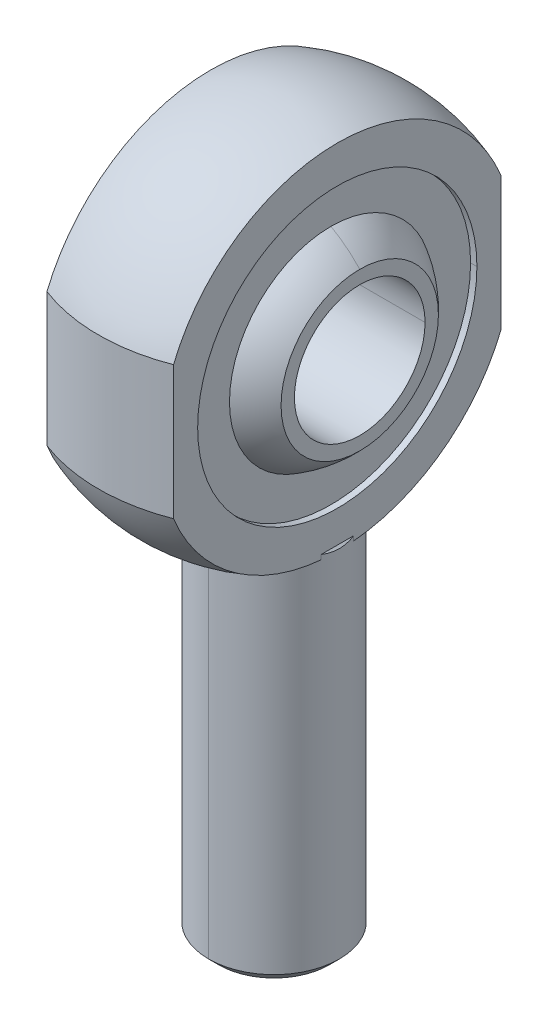
ISO-10303-21;
HEADER;
FILE_DESCRIPTION(('STEP AP214'),'2;1');
FILE_NAME('part.step','',(''),(''),'','','');
FILE_SCHEMA(('AUTOMOTIVE_DESIGN { 1 0 10303 214 1 1 1 1 }'));
ENDSEC;
DATA;
#1=APPLICATION_CONTEXT('core data for automotive mechanical design processes');
#2=APPLICATION_PROTOCOL_DEFINITION('international standard','automotive_design',2000,#1);
#3=PRODUCT_CONTEXT('',#1,'mechanical');
#4=PRODUCT('Part','Part','',(#3));
#5=PRODUCT_RELATED_PRODUCT_CATEGORY('part','',(#4));
#6=PRODUCT_DEFINITION_FORMATION('','',#4);
#7=PRODUCT_DEFINITION_CONTEXT('part definition',#1,'design');
#8=PRODUCT_DEFINITION('design','',#6,#7);
#9=PRODUCT_DEFINITION_SHAPE('','',#8);
#10=(LENGTH_UNIT() NAMED_UNIT(*) SI_UNIT(.MILLI.,.METRE.));
#11=(NAMED_UNIT(*) PLANE_ANGLE_UNIT() SI_UNIT($,.RADIAN.));
#12=(NAMED_UNIT(*) SI_UNIT($,.STERADIAN.) SOLID_ANGLE_UNIT());
#13=UNCERTAINTY_MEASURE_WITH_UNIT(LENGTH_MEASURE(1.E-05),#10,'distance_accuracy_value','');
#14=(GEOMETRIC_REPRESENTATION_CONTEXT(3) GLOBAL_UNCERTAINTY_ASSIGNED_CONTEXT((#13)) GLOBAL_UNIT_ASSIGNED_CONTEXT((#10,
#11,#12)) REPRESENTATION_CONTEXT('',''));
#15=CARTESIAN_POINT('',(0.,0.,0.));
#16=DIRECTION('',(0.,0.,1.));
#17=DIRECTION('',(1.,0.,0.));
#18=AXIS2_PLACEMENT_3D('',#15,#16,#17);
#19=CARTESIAN_POINT('',(10.5,-55.525,0.));
#20=DIRECTION('',(0.,-1.,0.));
#21=DIRECTION('',(1.,0.,0.));
#22=AXIS2_PLACEMENT_3D('',#19,#20,#21);
#23=CYLINDRICAL_SURFACE('',#22,8.);
#24=DIRECTION('',(0.,-1.,0.));
#25=VECTOR('',#24,1.);
#26=CARTESIAN_POINT('',(10.5,-21.5638586528556,8.));
#27=LINE('',#26,#25);
#28=CARTESIAN_POINT('',(10.5,-21.5638586528556,8.));
#29=VERTEX_POINT('',#28);
#30=CARTESIAN_POINT('',(10.5,-64.773,8.));
#31=VERTEX_POINT('',#30);
#32=EDGE_CURVE('E11',#29,#31,#27,.T.);
#33=ORIENTED_EDGE('',*,*,#32,.F.);
#34=CARTESIAN_POINT('',(10.5,-21.5638586528556,0.));
#35=DIRECTION('',(0.,1.,0.));
#36=DIRECTION('',(0.,0.,1.));
#37=AXIS2_PLACEMENT_3D('',#34,#35,#36);
#38=CIRCLE('',#37,8.);
#39=CARTESIAN_POINT('',(2.75,-21.5638586528481,1.98431348329844));
#40=VERTEX_POINT('',#39);
#41=EDGE_CURVE('E24',#40,#29,#38,.T.);
#42=ORIENTED_EDGE('',*,*,#41,.F.);
#43=DIRECTION('',(0.,-1.,0.));
#44=VECTOR('',#43,1.);
#45=CARTESIAN_POINT('',(2.75,-55.525,1.98431348329844));
#46=LINE('',#45,#44);
#47=CARTESIAN_POINT('',(2.75,-21.,1.98431348329844));
#48=VERTEX_POINT('',#47);
#49=EDGE_CURVE('E454',#48,#40,#46,.T.);
#50=ORIENTED_EDGE('',*,*,#49,.F.);
#51=CARTESIAN_POINT('',(10.5,-13.25,0.));
#52=DIRECTION('',(-0.707106781186548,0.707106781186548,0.));
#53=DIRECTION('',(-0.707106781186548,-0.707106781186548,0.));
#54=AXIS2_PLACEMENT_3D('',#51,#52,#53);
#55=ELLIPSE('',#54,11.3137084989848,8.);
#56=CARTESIAN_POINT('',(2.75,-21.,-1.98431348329844));
#57=VERTEX_POINT('',#56);
#58=EDGE_CURVE('E449',#57,#48,#55,.T.);
#59=ORIENTED_EDGE('',*,*,#58,.F.);
#60=DIRECTION('',(0.,1.,0.));
#61=VECTOR('',#60,1.);
#62=CARTESIAN_POINT('',(2.75,-55.525,-1.98431348329844));
#63=LINE('',#62,#61);
#64=CARTESIAN_POINT('',(2.75,-21.5638586528481,-1.98431348329844));
#65=VERTEX_POINT('',#64);
#66=EDGE_CURVE('E444',#65,#57,#63,.T.);
#67=ORIENTED_EDGE('',*,*,#66,.F.);
#68=CARTESIAN_POINT('',(10.5,-21.5638586528556,0.));
#69=DIRECTION('',(0.,1.,0.));
#70=DIRECTION('',(0.,0.,1.));
#71=AXIS2_PLACEMENT_3D('',#68,#69,#70);
#72=CIRCLE('',#71,8.);
#73=CARTESIAN_POINT('',(10.5,-21.5638586528556,-8.));
#74=VERTEX_POINT('',#73);
#75=EDGE_CURVE('E439',#74,#65,#72,.T.);
#76=ORIENTED_EDGE('',*,*,#75,.F.);
#77=DIRECTION('',(0.,-1.,0.));
#78=VECTOR('',#77,1.);
#79=CARTESIAN_POINT('',(10.5,-21.5638586528556,-8.));
#80=LINE('',#79,#78);
#81=CARTESIAN_POINT('',(10.5,-64.773,-8.));
#82=VERTEX_POINT('',#81);
#83=EDGE_CURVE('E435',#74,#82,#80,.T.);
#84=ORIENTED_EDGE('',*,*,#83,.T.);
#85=CARTESIAN_POINT('',(10.5,-64.773,0.));
#86=DIRECTION('',(0.,-1.,0.));
#87=DIRECTION('',(0.,0.,-1.));
#88=AXIS2_PLACEMENT_3D('',#85,#86,#87);
#89=CIRCLE('',#88,8.);
#90=EDGE_CURVE('E430',#31,#82,#89,.T.);
#91=ORIENTED_EDGE('',*,*,#90,.F.);
#92=EDGE_LOOP('',(#33,#42,#50,#59,#67,#76,#84,#91));
#93=FACE_BOUND('',#92,.T.);
#94=ADVANCED_FACE('F16',(#93),#23,.T.);
#95=CARTESIAN_POINT('',(10.5,-64.773,0.));
#96=DIRECTION('',(0.,1.,0.));
#97=DIRECTION('',(1.,0.,0.));
#98=AXIS2_PLACEMENT_3D('',#95,#96,#97);
#99=CONICAL_SURFACE('',#98,8.,0.785398163397446);
#100=DIRECTION('',(0.,0.70710678118655,-0.707106781186546));
#101=VECTOR('',#100,1.);
#102=CARTESIAN_POINT('',(10.5,-66.,-6.773));
#103=LINE('',#102,#101);
#104=CARTESIAN_POINT('',(10.5,-66.,-6.773));
#105=VERTEX_POINT('',#104);
#106=EDGE_CURVE('E425',#105,#82,#103,.T.);
#107=ORIENTED_EDGE('',*,*,#106,.F.);
#108=CARTESIAN_POINT('',(10.5,-66.,0.));
#109=DIRECTION('',(0.,-1.,0.));
#110=DIRECTION('',(0.,0.,-1.));
#111=AXIS2_PLACEMENT_3D('',#108,#109,#110);
#112=CIRCLE('',#111,6.773);
#113=CARTESIAN_POINT('',(10.5,-66.,6.773));
#114=VERTEX_POINT('',#113);
#115=EDGE_CURVE('E420',#114,#105,#112,.T.);
#116=ORIENTED_EDGE('',*,*,#115,.F.);
#117=DIRECTION('',(0.,0.70710678118655,0.707106781186546));
#118=VECTOR('',#117,1.);
#119=CARTESIAN_POINT('',(10.5,-66.,6.773));
#120=LINE('',#119,#118);
#121=EDGE_CURVE('E415',#114,#31,#120,.T.);
#122=ORIENTED_EDGE('',*,*,#121,.T.);
#123=ORIENTED_EDGE('',*,*,#90,.T.);
#124=EDGE_LOOP('',(#107,#116,#122,#123));
#125=FACE_BOUND('',#124,.T.);
#126=ADVANCED_FACE('F485',(#125),#99,.T.);
#127=CARTESIAN_POINT('',(10.5,-64.773,0.));
#128=DIRECTION('',(0.,1.,0.));
#129=DIRECTION('',(-1.,0.,0.));
#130=AXIS2_PLACEMENT_3D('',#127,#128,#129);
#131=CONICAL_SURFACE('',#130,8.,0.785398163397446);
#132=ORIENTED_EDGE('',*,*,#106,.T.);
#133=CARTESIAN_POINT('',(10.5,-64.773,0.));
#134=DIRECTION('',(0.,-1.,0.));
#135=DIRECTION('',(0.,0.,-1.));
#136=AXIS2_PLACEMENT_3D('',#133,#134,#135);
#137=CIRCLE('',#136,8.);
#138=EDGE_CURVE('E410',#82,#31,#137,.T.);
#139=ORIENTED_EDGE('',*,*,#138,.T.);
#140=ORIENTED_EDGE('',*,*,#121,.F.);
#141=CARTESIAN_POINT('',(10.5,-66.,0.));
#142=DIRECTION('',(0.,-1.,0.));
#143=DIRECTION('',(0.,0.,-1.));
#144=AXIS2_PLACEMENT_3D('',#141,#142,#143);
#145=CIRCLE('',#144,6.773);
#146=EDGE_CURVE('E405',#105,#114,#145,.T.);
#147=ORIENTED_EDGE('',*,*,#146,.F.);
#148=EDGE_LOOP('',(#132,#139,#140,#147));
#149=FACE_BOUND('',#148,.T.);
#150=ADVANCED_FACE('F483',(#149),#131,.T.);
#151=CARTESIAN_POINT('',(17.273,-66.,0.));
#152=DIRECTION('',(0.,1.,0.));
#153=DIRECTION('',(0.,0.,1.));
#154=AXIS2_PLACEMENT_3D('',#151,#152,#153);
#155=PLANE('',#154);
#156=ORIENTED_EDGE('',*,*,#146,.T.);
#157=ORIENTED_EDGE('',*,*,#115,.T.);
#158=EDGE_LOOP('',(#156,#157));
#159=FACE_BOUND('',#158,.T.);
#160=ADVANCED_FACE('F487',(#159),#155,.F.);
#161=CARTESIAN_POINT('',(10.5,-55.525,0.));
#162=DIRECTION('',(0.,-1.,0.));
#163=DIRECTION('',(-1.,0.,0.));
#164=AXIS2_PLACEMENT_3D('',#161,#162,#163);
#165=CYLINDRICAL_SURFACE('',#164,8.);
#166=ORIENTED_EDGE('',*,*,#32,.T.);
#167=ORIENTED_EDGE('',*,*,#138,.F.);
#168=ORIENTED_EDGE('',*,*,#83,.F.);
#169=CARTESIAN_POINT('',(10.5,-21.5638586528556,0.));
#170=DIRECTION('',(0.,1.,0.));
#171=DIRECTION('',(0.,0.,1.));
#172=AXIS2_PLACEMENT_3D('',#169,#170,#171);
#173=CIRCLE('',#172,8.);
#174=CARTESIAN_POINT('',(18.25,-21.5638586528556,-1.98431348325763));
#175=VERTEX_POINT('',#174);
#176=EDGE_CURVE('E400',#175,#74,#173,.T.);
#177=ORIENTED_EDGE('',*,*,#176,.F.);
#178=DIRECTION('',(0.,-1.,0.));
#179=VECTOR('',#178,1.);
#180=CARTESIAN_POINT('',(18.25,-55.525,-1.98431348329844));
#181=LINE('',#180,#179);
#182=CARTESIAN_POINT('',(18.25,-21.,-1.98431348329844));
#183=VERTEX_POINT('',#182);
#184=EDGE_CURVE('E395',#183,#175,#181,.T.);
#185=ORIENTED_EDGE('',*,*,#184,.F.);
#186=CARTESIAN_POINT('',(10.5,-13.25,0.));
#187=DIRECTION('',(0.707106781186548,0.707106781186548,0.));
#188=DIRECTION('',(0.707106781186548,-0.707106781186548,0.));
#189=AXIS2_PLACEMENT_3D('',#186,#187,#188);
#190=ELLIPSE('',#189,11.3137084989848,8.);
#191=CARTESIAN_POINT('',(18.25,-21.,1.98431348329844));
#192=VERTEX_POINT('',#191);
#193=EDGE_CURVE('E390',#192,#183,#190,.T.);
#194=ORIENTED_EDGE('',*,*,#193,.F.);
#195=DIRECTION('',(0.,1.,0.));
#196=VECTOR('',#195,1.);
#197=CARTESIAN_POINT('',(18.25,-55.525,1.98431348329844));
#198=LINE('',#197,#196);
#199=CARTESIAN_POINT('',(18.25,-21.5638586528556,1.98431348325763));
#200=VERTEX_POINT('',#199);
#201=EDGE_CURVE('E385',#200,#192,#198,.T.);
#202=ORIENTED_EDGE('',*,*,#201,.F.);
#203=CARTESIAN_POINT('',(10.5,-21.5638586528556,0.));
#204=DIRECTION('',(0.,1.,0.));
#205=DIRECTION('',(0.,0.,1.));
#206=AXIS2_PLACEMENT_3D('',#203,#204,#205);
#207=CIRCLE('',#206,8.);
#208=EDGE_CURVE('E380',#29,#200,#207,.T.);
#209=ORIENTED_EDGE('',*,*,#208,.F.);
#210=EDGE_LOOP('',(#166,#167,#168,#177,#185,#194,#202,#209));
#211=FACE_BOUND('',#210,.T.);
#212=ADVANCED_FACE('F479',(#211),#165,.T.);
#213=CARTESIAN_POINT('',(10.5,-3.7470027081099E-12,0.));
#214=DIRECTION('',(1.,0.,0.));
#215=DIRECTION('',(0.,0.796262108454219,-0.604951778772525));
#216=AXIS2_PLACEMENT_3D('',#213,#214,#215);
#217=SPHERICAL_SURFACE('',#216,23.0000000000038);
#218=CARTESIAN_POINT('',(2.75,0.,0.));
#219=DIRECTION('',(1.,0.,0.));
#220=DIRECTION('',(0.,0.,-1.));
#221=AXIS2_PLACEMENT_3D('',#218,#219,#220);
#222=CIRCLE('',#221,21.654964788704);
#223=CARTESIAN_POINT('',(2.75,-8.17006731918472,20.0546129356814));
#224=VERTEX_POINT('',#223);
#225=EDGE_CURVE('E376',#224,#40,#222,.T.);
#226=ORIENTED_EDGE('',*,*,#225,.T.);
#227=ORIENTED_EDGE('',*,*,#41,.T.);
#228=ORIENTED_EDGE('',*,*,#208,.T.);
#229=CARTESIAN_POINT('',(18.25,0.,0.));
#230=DIRECTION('',(1.,0.,0.));
#231=DIRECTION('',(0.,0.,-1.));
#232=AXIS2_PLACEMENT_3D('',#229,#230,#231);
#233=CIRCLE('',#232,21.654964788704);
#234=CARTESIAN_POINT('',(18.25,-8.17006731919838,20.0546129356786));
#235=VERTEX_POINT('',#234);
#236=EDGE_CURVE('E371',#235,#200,#233,.T.);
#237=ORIENTED_EDGE('',*,*,#236,.F.);
#238=CARTESIAN_POINT('',(10.5,-8.17006731919838,0.));
#239=DIRECTION('',(0.,1.,0.));
#240=DIRECTION('',(0.,0.,1.));
#241=AXIS2_PLACEMENT_3D('',#238,#239,#240);
#242=CIRCLE('',#241,21.5);
#243=EDGE_CURVE('E366',#224,#235,#242,.T.);
#244=ORIENTED_EDGE('',*,*,#243,.F.);
#245=EDGE_LOOP('',(#226,#227,#228,#237,#244));
#246=FACE_BOUND('',#245,.T.);
#247=ADVANCED_FACE('F464',(#246),#217,.T.);
#248=CARTESIAN_POINT('',(10.5,43.,0.));
#249=DIRECTION('',(0.,-1.,0.));
#250=DIRECTION('',(0.,0.,-1.));
#251=AXIS2_PLACEMENT_3D('',#248,#249,#250);
#252=CYLINDRICAL_SURFACE('',#251,21.5);
#253=DIRECTION('',(0.,1.,0.));
#254=VECTOR('',#253,1.);
#255=CARTESIAN_POINT('',(18.25,43.,20.0546129356814));
#256=LINE('',#255,#254);
#257=CARTESIAN_POINT('',(18.25,8.17006731919089,20.0546129356802));
#258=VERTEX_POINT('',#257);
#259=EDGE_CURVE('E362',#235,#258,#256,.T.);
#260=ORIENTED_EDGE('',*,*,#259,.T.);
#261=CARTESIAN_POINT('',(10.5,8.17006731919089,0.));
#262=DIRECTION('',(0.,-1.,0.));
#263=DIRECTION('',(0.,0.,-1.));
#264=AXIS2_PLACEMENT_3D('',#261,#262,#263);
#265=CIRCLE('',#264,21.5);
#266=CARTESIAN_POINT('',(2.75,8.17006731918472,20.0546129356814));
#267=VERTEX_POINT('',#266);
#268=EDGE_CURVE('E358',#258,#267,#265,.T.);
#269=ORIENTED_EDGE('',*,*,#268,.T.);
#270=DIRECTION('',(0.,-1.,0.));
#271=VECTOR('',#270,1.);
#272=CARTESIAN_POINT('',(2.75,43.,20.0546129356814));
#273=LINE('',#272,#271);
#274=EDGE_CURVE('E353',#267,#224,#273,.T.);
#275=ORIENTED_EDGE('',*,*,#274,.T.);
#276=ORIENTED_EDGE('',*,*,#243,.T.);
#277=EDGE_LOOP('',(#260,#269,#275,#276));
#278=FACE_BOUND('',#277,.T.);
#279=ADVANCED_FACE('F531',(#278),#252,.T.);
#280=CARTESIAN_POINT('',(2.75,21.654964788704,0.));
#281=DIRECTION('',(-1.,0.,0.));
#282=DIRECTION('',(0.,0.,1.));
#283=AXIS2_PLACEMENT_3D('',#280,#281,#282);
#284=PLANE('',#283);
#285=CARTESIAN_POINT('',(2.75,0.,0.));
#286=DIRECTION('',(1.,0.,0.));
#287=DIRECTION('',(0.,0.,-1.));
#288=AXIS2_PLACEMENT_3D('',#285,#286,#287);
#289=CIRCLE('',#288,17.1);
#290=CARTESIAN_POINT('',(2.75,0.,-17.1));
#291=VERTEX_POINT('',#290);
#292=CARTESIAN_POINT('',(2.75,0.,17.1));
#293=VERTEX_POINT('',#292);
#294=EDGE_CURVE('E168',#291,#293,#289,.T.);
#295=ORIENTED_EDGE('',*,*,#294,.T.);
#296=CARTESIAN_POINT('',(2.75,0.,0.));
#297=DIRECTION('',(1.,0.,0.));
#298=DIRECTION('',(0.,0.,-1.));
#299=AXIS2_PLACEMENT_3D('',#296,#297,#298);
#300=CIRCLE('',#299,17.1);
#301=EDGE_CURVE('E346',#293,#291,#300,.T.);
#302=ORIENTED_EDGE('',*,*,#301,.T.);
#303=EDGE_LOOP('',(#295,#302));
#304=FACE_BOUND('',#303,.T.);
#305=ORIENTED_EDGE('',*,*,#66,.T.);
#306=DIRECTION('',(0.,0.,-1.));
#307=VECTOR('',#306,1.);
#308=CARTESIAN_POINT('',(2.75,-21.,43.));
#309=LINE('',#308,#307);
#310=EDGE_CURVE('E341',#48,#57,#309,.T.);
#311=ORIENTED_EDGE('',*,*,#310,.F.);
#312=ORIENTED_EDGE('',*,*,#49,.T.);
#313=ORIENTED_EDGE('',*,*,#225,.F.);
#314=ORIENTED_EDGE('',*,*,#274,.F.);
#315=CARTESIAN_POINT('',(2.75,0.,0.));
#316=DIRECTION('',(1.,0.,0.));
#317=DIRECTION('',(0.,0.,-1.));
#318=AXIS2_PLACEMENT_3D('',#315,#316,#317);
#319=CIRCLE('',#318,21.654964788704);
#320=CARTESIAN_POINT('',(2.75,8.17006731918472,-20.0546129356814));
#321=VERTEX_POINT('',#320);
#322=EDGE_CURVE('E336',#321,#267,#319,.T.);
#323=ORIENTED_EDGE('',*,*,#322,.F.);
#324=DIRECTION('',(0.,1.,0.));
#325=VECTOR('',#324,1.);
#326=CARTESIAN_POINT('',(2.75,43.,-20.0546129356814));
#327=LINE('',#326,#325);
#328=CARTESIAN_POINT('',(2.75,-8.17006731918472,-20.0546129356814));
#329=VERTEX_POINT('',#328);
#330=EDGE_CURVE('E331',#329,#321,#327,.T.);
#331=ORIENTED_EDGE('',*,*,#330,.F.);
#332=CARTESIAN_POINT('',(2.75,0.,0.));
#333=DIRECTION('',(1.,0.,0.));
#334=DIRECTION('',(0.,0.,-1.));
#335=AXIS2_PLACEMENT_3D('',#332,#333,#334);
#336=CIRCLE('',#335,21.654964788704);
#337=EDGE_CURVE('E326',#65,#329,#336,.T.);
#338=ORIENTED_EDGE('',*,*,#337,.F.);
#339=EDGE_LOOP('',(#305,#311,#312,#313,#314,#323,#331,#338));
#340=FACE_BOUND('',#339,.T.);
#341=ADVANCED_FACE('F469',(#304,#340),#284,.T.);
#342=CARTESIAN_POINT('',(10.5,-3.7470027081099E-12,0.));
#343=DIRECTION('',(1.,0.,0.));
#344=DIRECTION('',(0.,0.79626210845422,0.604951778772524));
#345=AXIS2_PLACEMENT_3D('',#342,#343,#344);
#346=SPHERICAL_SURFACE('',#345,23.0000000000038);
#347=CARTESIAN_POINT('',(18.25,0.,0.));
#348=DIRECTION('',(1.,0.,0.));
#349=DIRECTION('',(0.,0.,-1.));
#350=AXIS2_PLACEMENT_3D('',#347,#348,#349);
#351=CIRCLE('',#350,21.654964788704);
#352=CARTESIAN_POINT('',(18.25,-8.17006731919838,-20.0546129356786));
#353=VERTEX_POINT('',#352);
#354=EDGE_CURVE('E321',#175,#353,#351,.T.);
#355=ORIENTED_EDGE('',*,*,#354,.F.);
#356=ORIENTED_EDGE('',*,*,#176,.T.);
#357=ORIENTED_EDGE('',*,*,#75,.T.);
#358=ORIENTED_EDGE('',*,*,#337,.T.);
#359=CARTESIAN_POINT('',(10.5,-8.17006731919838,0.));
#360=DIRECTION('',(0.,1.,0.));
#361=DIRECTION('',(0.,0.,1.));
#362=AXIS2_PLACEMENT_3D('',#359,#360,#361);
#363=CIRCLE('',#362,21.5);
#364=EDGE_CURVE('E316',#353,#329,#363,.T.);
#365=ORIENTED_EDGE('',*,*,#364,.F.);
#366=EDGE_LOOP('',(#355,#356,#357,#358,#365));
#367=FACE_BOUND('',#366,.T.);
#368=ADVANCED_FACE('F475',(#367),#346,.T.);
#369=CARTESIAN_POINT('',(10.5,43.,0.));
#370=DIRECTION('',(0.,-1.,0.));
#371=DIRECTION('',(0.,0.,1.));
#372=AXIS2_PLACEMENT_3D('',#369,#370,#371);
#373=CYLINDRICAL_SURFACE('',#372,21.5);
#374=DIRECTION('',(0.,-1.,0.));
#375=VECTOR('',#374,1.);
#376=CARTESIAN_POINT('',(18.25,43.,-20.0546129356814));
#377=LINE('',#376,#375);
#378=CARTESIAN_POINT('',(18.25,8.17006731919089,-20.0546129356802));
#379=VERTEX_POINT('',#378);
#380=EDGE_CURVE('E311',#379,#353,#377,.T.);
#381=ORIENTED_EDGE('',*,*,#380,.T.);
#382=ORIENTED_EDGE('',*,*,#364,.T.);
#383=ORIENTED_EDGE('',*,*,#330,.T.);
#384=CARTESIAN_POINT('',(10.5,8.17006731919089,0.));
#385=DIRECTION('',(0.,-1.,0.));
#386=DIRECTION('',(0.,0.,-1.));
#387=AXIS2_PLACEMENT_3D('',#384,#385,#386);
#388=CIRCLE('',#387,21.5);
#389=EDGE_CURVE('E307',#321,#379,#388,.T.);
#390=ORIENTED_EDGE('',*,*,#389,.T.);
#391=EDGE_LOOP('',(#381,#382,#383,#390));
#392=FACE_BOUND('',#391,.T.);
#393=ADVANCED_FACE('F558',(#392),#373,.T.);
#394=CARTESIAN_POINT('',(10.5,-3.7470027081099E-12,0.));
#395=DIRECTION('',(1.,0.,0.));
#396=DIRECTION('',(0.,-1.,0.));
#397=AXIS2_PLACEMENT_3D('',#394,#395,#396);
#398=SPHERICAL_SURFACE('',#397,23.0000000000038);
#399=ORIENTED_EDGE('',*,*,#389,.F.);
#400=ORIENTED_EDGE('',*,*,#322,.T.);
#401=ORIENTED_EDGE('',*,*,#268,.F.);
#402=CARTESIAN_POINT('',(18.25,0.,0.));
#403=DIRECTION('',(1.,0.,0.));
#404=DIRECTION('',(0.,0.,-1.));
#405=AXIS2_PLACEMENT_3D('',#402,#403,#404);
#406=CIRCLE('',#405,21.654964788704);
#407=EDGE_CURVE('E302',#379,#258,#406,.T.);
#408=ORIENTED_EDGE('',*,*,#407,.F.);
#409=EDGE_LOOP('',(#399,#400,#401,#408));
#410=FACE_BOUND('',#409,.T.);
#411=ADVANCED_FACE('F567',(#410),#398,.T.);
#412=CARTESIAN_POINT('',(18.25,17.1,0.));
#413=DIRECTION('',(1.,0.,0.));
#414=DIRECTION('',(0.,0.,-1.));
#415=AXIS2_PLACEMENT_3D('',#412,#413,#414);
#416=PLANE('',#415);
#417=ORIENTED_EDGE('',*,*,#380,.F.);
#418=ORIENTED_EDGE('',*,*,#407,.T.);
#419=ORIENTED_EDGE('',*,*,#259,.F.);
#420=ORIENTED_EDGE('',*,*,#236,.T.);
#421=ORIENTED_EDGE('',*,*,#201,.T.);
#422=DIRECTION('',(0.,0.,-1.));
#423=VECTOR('',#422,1.);
#424=CARTESIAN_POINT('',(18.25,-21.,43.));
#425=LINE('',#424,#423);
#426=EDGE_CURVE('E297',#192,#183,#425,.T.);
#427=ORIENTED_EDGE('',*,*,#426,.T.);
#428=ORIENTED_EDGE('',*,*,#184,.T.);
#429=ORIENTED_EDGE('',*,*,#354,.T.);
#430=EDGE_LOOP('',(#417,#418,#419,#420,#421,#427,#428,#429));
#431=FACE_BOUND('',#430,.T.);
#432=CARTESIAN_POINT('',(18.25,0.,0.));
#433=DIRECTION('',(1.,0.,0.));
#434=DIRECTION('',(0.,0.,-1.));
#435=AXIS2_PLACEMENT_3D('',#432,#433,#434);
#436=CIRCLE('',#435,17.1);
#437=CARTESIAN_POINT('',(18.25,0.,17.1));
#438=VERTEX_POINT('',#437);
#439=CARTESIAN_POINT('',(18.25,0.,-17.1));
#440=VERTEX_POINT('',#439);
#441=EDGE_CURVE('E292',#438,#440,#436,.T.);
#442=ORIENTED_EDGE('',*,*,#441,.F.);
#443=CARTESIAN_POINT('',(18.25,0.,0.));
#444=DIRECTION('',(1.,0.,0.));
#445=DIRECTION('',(0.,0.,-1.));
#446=AXIS2_PLACEMENT_3D('',#443,#444,#445);
#447=CIRCLE('',#446,17.1);
#448=EDGE_CURVE('E287',#440,#438,#447,.T.);
#449=ORIENTED_EDGE('',*,*,#448,.F.);
#450=EDGE_LOOP('',(#442,#449));
#451=FACE_BOUND('',#450,.T.);
#452=ADVANCED_FACE('F577',(#431,#451),#416,.T.);
#453=CARTESIAN_POINT('',(100.,0.,0.));
#454=DIRECTION('',(1.,0.,0.));
#455=DIRECTION('',(0.,-1.,0.));
#456=AXIS2_PLACEMENT_3D('',#453,#454,#455);
#457=CYLINDRICAL_SURFACE('',#456,17.1);
#458=DIRECTION('',(1.,0.,0.));
#459=VECTOR('',#458,1.);
#460=CARTESIAN_POINT('',(17.475,0.,17.1));
#461=LINE('',#460,#459);
#462=CARTESIAN_POINT('',(17.475,0.,17.1));
#463=VERTEX_POINT('',#462);
#464=EDGE_CURVE('E282',#463,#438,#461,.T.);
#465=ORIENTED_EDGE('',*,*,#464,.F.);
#466=CARTESIAN_POINT('',(17.475,0.,0.));
#467=DIRECTION('',(1.,0.,0.));
#468=DIRECTION('',(0.,0.,-1.));
#469=AXIS2_PLACEMENT_3D('',#466,#467,#468);
#470=CIRCLE('',#469,17.1);
#471=CARTESIAN_POINT('',(17.475,0.,-17.1));
#472=VERTEX_POINT('',#471);
#473=EDGE_CURVE('E277',#472,#463,#470,.T.);
#474=ORIENTED_EDGE('',*,*,#473,.F.);
#475=DIRECTION('',(1.,0.,0.));
#476=VECTOR('',#475,1.);
#477=CARTESIAN_POINT('',(17.475,0.,-17.1));
#478=LINE('',#477,#476);
#479=EDGE_CURVE('E272',#472,#440,#478,.T.);
#480=ORIENTED_EDGE('',*,*,#479,.T.);
#481=ORIENTED_EDGE('',*,*,#448,.T.);
#482=EDGE_LOOP('',(#465,#474,#480,#481));
#483=FACE_BOUND('',#482,.T.);
#484=ADVANCED_FACE('F587',(#483),#457,.F.);
#485=CARTESIAN_POINT('',(100.,0.,0.));
#486=DIRECTION('',(1.,0.,0.));
#487=DIRECTION('',(0.,1.,0.));
#488=AXIS2_PLACEMENT_3D('',#485,#486,#487);
#489=CYLINDRICAL_SURFACE('',#488,17.1);
#490=ORIENTED_EDGE('',*,*,#464,.T.);
#491=ORIENTED_EDGE('',*,*,#441,.T.);
#492=ORIENTED_EDGE('',*,*,#479,.F.);
#493=CARTESIAN_POINT('',(17.475,0.,0.));
#494=DIRECTION('',(1.,0.,0.));
#495=DIRECTION('',(0.,0.,-1.));
#496=AXIS2_PLACEMENT_3D('',#493,#494,#495);
#497=CIRCLE('',#496,17.1);
#498=EDGE_CURVE('E267',#463,#472,#497,.T.);
#499=ORIENTED_EDGE('',*,*,#498,.F.);
#500=EDGE_LOOP('',(#490,#491,#492,#499));
#501=FACE_BOUND('',#500,.T.);
#502=ADVANCED_FACE('F597',(#501),#489,.F.);
#503=CARTESIAN_POINT('',(17.475,12.426257481639,0.));
#504=DIRECTION('',(1.,0.,0.));
#505=DIRECTION('',(0.,0.,-1.));
#506=AXIS2_PLACEMENT_3D('',#503,#504,#505);
#507=PLANE('',#506);
#508=ORIENTED_EDGE('',*,*,#473,.T.);
#509=ORIENTED_EDGE('',*,*,#498,.T.);
#510=EDGE_LOOP('',(#508,#509));
#511=FACE_BOUND('',#510,.T.);
#512=CARTESIAN_POINT('',(17.475,0.,0.));
#513=DIRECTION('',(1.,0.,0.));
#514=DIRECTION('',(0.,-1.,0.));
#515=AXIS2_PLACEMENT_3D('',#512,#513,#514);
#516=CIRCLE('',#515,12.426257481639);
#517=CARTESIAN_POINT('',(17.4749999999967,-12.4262574816252,0.));
#518=VERTEX_POINT('',#517);
#519=CARTESIAN_POINT('',(17.4749999999967,12.4262574816409,0.));
#520=VERTEX_POINT('',#519);
#521=EDGE_CURVE('E262',#518,#520,#516,.T.);
#522=ORIENTED_EDGE('',*,*,#521,.F.);
#523=CARTESIAN_POINT('',(17.475,0.,0.));
#524=DIRECTION('',(1.,0.,0.));
#525=DIRECTION('',(0.,0.,-1.));
#526=AXIS2_PLACEMENT_3D('',#523,#524,#525);
#527=CIRCLE('',#526,12.426257481639);
#528=EDGE_CURVE('E257',#520,#518,#527,.T.);
#529=ORIENTED_EDGE('',*,*,#528,.F.);
#530=EDGE_LOOP('',(#522,#529));
#531=FACE_BOUND('',#530,.T.);
#532=ADVANCED_FACE('F607',(#511,#531),#507,.T.);
#533=CARTESIAN_POINT('',(10.5000000000076,7.82880704708333E-12,0.));
#534=DIRECTION('',(1.,0.,0.));
#535=DIRECTION('',(0.,0.,-1.));
#536=AXIS2_PLACEMENT_3D('',#533,#534,#535);
#537=SPHERICAL_SURFACE('',#536,14.2499999999891);
#538=CARTESIAN_POINT('',(10.5000000000076,7.82880704708333E-12,0.));
#539=DIRECTION('',(0.,0.,-1.));
#540=DIRECTION('',(0.736842105262916,-0.676064872561587,0.));
#541=AXIS2_PLACEMENT_3D('',#538,#539,#540);
#542=CIRCLE('',#541,14.2499999999891);
#543=CARTESIAN_POINT('',(20.9999999999961,-9.6339244339874,0.));
#544=VERTEX_POINT('',#543);
#545=EDGE_CURVE('E252',#544,#518,#542,.T.);
#546=ORIENTED_EDGE('',*,*,#545,.F.);
#547=CARTESIAN_POINT('',(21.,0.,0.));
#548=DIRECTION('',(1.,0.,0.));
#549=DIRECTION('',(0.,0.,-1.));
#550=AXIS2_PLACEMENT_3D('',#547,#548,#549);
#551=CIRCLE('',#550,9.6339244339988);
#552=CARTESIAN_POINT('',(20.9999999999961,9.63392443400305,0.));
#553=VERTEX_POINT('',#552);
#554=EDGE_CURVE('E247',#553,#544,#551,.T.);
#555=ORIENTED_EDGE('',*,*,#554,.F.);
#556=CARTESIAN_POINT('',(10.5000000000076,7.82880704708333E-12,0.));
#557=DIRECTION('',(0.,0.,1.));
#558=DIRECTION('',(0.736842105262916,0.676064872561587,0.));
#559=AXIS2_PLACEMENT_3D('',#556,#557,#558);
#560=CIRCLE('',#559,14.2499999999891);
#561=EDGE_CURVE('E242',#553,#520,#560,.T.);
#562=ORIENTED_EDGE('',*,*,#561,.T.);
#563=ORIENTED_EDGE('',*,*,#528,.T.);
#564=EDGE_LOOP('',(#546,#555,#562,#563));
#565=FACE_BOUND('',#564,.T.);
#566=ADVANCED_FACE('F617',(#565),#537,.T.);
#567=CARTESIAN_POINT('',(10.5000000000076,7.82880704708333E-12,0.));
#568=DIRECTION('',(1.,0.,0.));
#569=DIRECTION('',(0.,0.,1.));
#570=AXIS2_PLACEMENT_3D('',#567,#568,#569);
#571=SPHERICAL_SURFACE('',#570,14.2499999999891);
#572=ORIENTED_EDGE('',*,*,#545,.T.);
#573=ORIENTED_EDGE('',*,*,#521,.T.);
#574=ORIENTED_EDGE('',*,*,#561,.F.);
#575=CARTESIAN_POINT('',(21.,0.,0.));
#576=DIRECTION('',(1.,0.,0.));
#577=DIRECTION('',(0.,-1.,0.));
#578=AXIS2_PLACEMENT_3D('',#575,#576,#577);
#579=CIRCLE('',#578,9.6339244339988);
#580=EDGE_CURVE('E237',#544,#553,#579,.T.);
#581=ORIENTED_EDGE('',*,*,#580,.F.);
#582=EDGE_LOOP('',(#572,#573,#574,#581));
#583=FACE_BOUND('',#582,.T.);
#584=ADVANCED_FACE('F627',(#583),#571,.T.);
#585=CARTESIAN_POINT('',(21.,8.,0.));
#586=DIRECTION('',(1.,0.,0.));
#587=DIRECTION('',(0.,0.,-1.));
#588=AXIS2_PLACEMENT_3D('',#585,#586,#587);
#589=PLANE('',#588);
#590=ORIENTED_EDGE('',*,*,#554,.T.);
#591=ORIENTED_EDGE('',*,*,#580,.T.);
#592=EDGE_LOOP('',(#590,#591));
#593=FACE_BOUND('',#592,.T.);
#594=CARTESIAN_POINT('',(21.,0.,0.));
#595=DIRECTION('',(1.,0.,0.));
#596=DIRECTION('',(0.,0.,-1.));
#597=AXIS2_PLACEMENT_3D('',#594,#595,#596);
#598=CIRCLE('',#597,8.);
#599=CARTESIAN_POINT('',(21.,0.,8.));
#600=VERTEX_POINT('',#599);
#601=CARTESIAN_POINT('',(21.,0.,-8.));
#602=VERTEX_POINT('',#601);
#603=EDGE_CURVE('E232',#600,#602,#598,.T.);
#604=ORIENTED_EDGE('',*,*,#603,.F.);
#605=CARTESIAN_POINT('',(21.,0.,0.));
#606=DIRECTION('',(1.,0.,0.));
#607=DIRECTION('',(0.,0.,-1.));
#608=AXIS2_PLACEMENT_3D('',#605,#606,#607);
#609=CIRCLE('',#608,8.);
#610=EDGE_CURVE('E227',#602,#600,#609,.T.);
#611=ORIENTED_EDGE('',*,*,#610,.F.);
#612=EDGE_LOOP('',(#604,#611));
#613=FACE_BOUND('',#612,.T.);
#614=ADVANCED_FACE('F637',(#593,#613),#589,.T.);
#615=CARTESIAN_POINT('',(100.,0.,0.));
#616=DIRECTION('',(1.,0.,0.));
#617=DIRECTION('',(0.,-1.,0.));
#618=AXIS2_PLACEMENT_3D('',#615,#616,#617);
#619=CYLINDRICAL_SURFACE('',#618,8.);
#620=DIRECTION('',(1.,0.,0.));
#621=VECTOR('',#620,1.);
#622=CARTESIAN_POINT('',(0.,0.,8.));
#623=LINE('',#622,#621);
#624=CARTESIAN_POINT('',(0.,0.,8.));
#625=VERTEX_POINT('',#624);
#626=EDGE_CURVE('E222',#625,#600,#623,.T.);
#627=ORIENTED_EDGE('',*,*,#626,.F.);
#628=CARTESIAN_POINT('',(0.,0.,0.));
#629=DIRECTION('',(1.,0.,0.));
#630=DIRECTION('',(0.,0.,-1.));
#631=AXIS2_PLACEMENT_3D('',#628,#629,#630);
#632=CIRCLE('',#631,8.);
#633=CARTESIAN_POINT('',(0.,0.,-8.));
#634=VERTEX_POINT('',#633);
#635=EDGE_CURVE('E217',#634,#625,#632,.T.);
#636=ORIENTED_EDGE('',*,*,#635,.F.);
#637=DIRECTION('',(1.,0.,0.));
#638=VECTOR('',#637,1.);
#639=CARTESIAN_POINT('',(0.,0.,-8.));
#640=LINE('',#639,#638);
#641=EDGE_CURVE('E212',#634,#602,#640,.T.);
#642=ORIENTED_EDGE('',*,*,#641,.T.);
#643=ORIENTED_EDGE('',*,*,#610,.T.);
#644=EDGE_LOOP('',(#627,#636,#642,#643));
#645=FACE_BOUND('',#644,.T.);
#646=ADVANCED_FACE('F647',(#645),#619,.F.);
#647=CARTESIAN_POINT('',(100.,0.,0.));
#648=DIRECTION('',(1.,0.,0.));
#649=DIRECTION('',(0.,1.,0.));
#650=AXIS2_PLACEMENT_3D('',#647,#648,#649);
#651=CYLINDRICAL_SURFACE('',#650,8.);
#652=ORIENTED_EDGE('',*,*,#626,.T.);
#653=ORIENTED_EDGE('',*,*,#603,.T.);
#654=ORIENTED_EDGE('',*,*,#641,.F.);
#655=CARTESIAN_POINT('',(0.,0.,0.));
#656=DIRECTION('',(1.,0.,0.));
#657=DIRECTION('',(0.,0.,-1.));
#658=AXIS2_PLACEMENT_3D('',#655,#656,#657);
#659=CIRCLE('',#658,8.);
#660=EDGE_CURVE('E207',#625,#634,#659,.T.);
#661=ORIENTED_EDGE('',*,*,#660,.F.);
#662=EDGE_LOOP('',(#652,#653,#654,#661));
#663=FACE_BOUND('',#662,.T.);
#664=ADVANCED_FACE('F657',(#663),#651,.F.);
#665=CARTESIAN_POINT('',(0.,9.6339244339988,0.));
#666=DIRECTION('',(-1.,0.,0.));
#667=DIRECTION('',(0.,0.,1.));
#668=AXIS2_PLACEMENT_3D('',#665,#666,#667);
#669=PLANE('',#668);
#670=ORIENTED_EDGE('',*,*,#635,.T.);
#671=ORIENTED_EDGE('',*,*,#660,.T.);
#672=EDGE_LOOP('',(#670,#671));
#673=FACE_BOUND('',#672,.T.);
#674=CARTESIAN_POINT('',(0.,0.,0.));
#675=DIRECTION('',(1.,0.,0.));
#676=DIRECTION('',(0.,0.,-1.));
#677=AXIS2_PLACEMENT_3D('',#674,#675,#676);
#678=CIRCLE('',#677,9.6339244339988);
#679=CARTESIAN_POINT('',(0.,9.63392443399885,0.));
#680=VERTEX_POINT('',#679);
#681=CARTESIAN_POINT('',(0.,-9.63392443399867,0.));
#682=VERTEX_POINT('',#681);
#683=EDGE_CURVE('E202',#680,#682,#678,.T.);
#684=ORIENTED_EDGE('',*,*,#683,.F.);
#685=CARTESIAN_POINT('',(0.,0.,0.));
#686=DIRECTION('',(1.,0.,0.));
#687=DIRECTION('',(0.,-1.,0.));
#688=AXIS2_PLACEMENT_3D('',#685,#686,#687);
#689=CIRCLE('',#688,9.6339244339988);
#690=EDGE_CURVE('E197',#682,#680,#689,.T.);
#691=ORIENTED_EDGE('',*,*,#690,.F.);
#692=EDGE_LOOP('',(#684,#691));
#693=FACE_BOUND('',#692,.T.);
#694=ADVANCED_FACE('F667',(#673,#693),#669,.T.);
#695=CARTESIAN_POINT('',(10.4999999999985,0.,0.));
#696=DIRECTION('',(1.,0.,0.));
#697=DIRECTION('',(0.,0.,1.));
#698=AXIS2_PLACEMENT_3D('',#695,#696,#697);
#699=SPHERICAL_SURFACE('',#698,14.2499999999988);
#700=CARTESIAN_POINT('',(10.4999999999985,0.,0.));
#701=DIRECTION('',(0.,0.,-1.));
#702=DIRECTION('',(-0.48947368421046,-0.872018068887015,0.));
#703=AXIS2_PLACEMENT_3D('',#700,#701,#702);
#704=CIRCLE('',#703,14.2499999999988);
#705=CARTESIAN_POINT('',(3.52500000000004,-12.4262574816388,0.));
#706=VERTEX_POINT('',#705);
#707=EDGE_CURVE('E192',#706,#682,#704,.T.);
#708=ORIENTED_EDGE('',*,*,#707,.T.);
#709=ORIENTED_EDGE('',*,*,#690,.T.);
#710=CARTESIAN_POINT('',(10.4999999999985,0.,0.));
#711=DIRECTION('',(0.,0.,1.));
#712=DIRECTION('',(-0.48947368421046,0.872018068887015,0.));
#713=AXIS2_PLACEMENT_3D('',#710,#711,#712);
#714=CIRCLE('',#713,14.2499999999988);
#715=CARTESIAN_POINT('',(3.52500000000004,12.426257481639,0.));
#716=VERTEX_POINT('',#715);
#717=EDGE_CURVE('E187',#716,#680,#714,.T.);
#718=ORIENTED_EDGE('',*,*,#717,.F.);
#719=CARTESIAN_POINT('',(3.525,0.,0.));
#720=DIRECTION('',(1.,0.,0.));
#721=DIRECTION('',(0.,-1.,0.));
#722=AXIS2_PLACEMENT_3D('',#719,#720,#721);
#723=CIRCLE('',#722,12.426257481639);
#724=EDGE_CURVE('E176',#706,#716,#723,.T.);
#725=ORIENTED_EDGE('',*,*,#724,.F.);
#726=EDGE_LOOP('',(#708,#709,#718,#725));
#727=FACE_BOUND('',#726,.T.);
#728=ADVANCED_FACE('F677',(#727),#699,.T.);
#729=CARTESIAN_POINT('',(3.525,17.1,0.));
#730=DIRECTION('',(-1.,0.,0.));
#731=DIRECTION('',(0.,0.,1.));
#732=AXIS2_PLACEMENT_3D('',#729,#730,#731);
#733=PLANE('',#732);
#734=CARTESIAN_POINT('',(3.525,0.,0.));
#735=DIRECTION('',(1.,0.,0.));
#736=DIRECTION('',(0.,0.,-1.));
#737=AXIS2_PLACEMENT_3D('',#734,#735,#736);
#738=CIRCLE('',#737,12.426257481639);
#739=EDGE_CURVE('E173',#716,#706,#738,.T.);
#740=ORIENTED_EDGE('',*,*,#739,.T.);
#741=ORIENTED_EDGE('',*,*,#724,.T.);
#742=EDGE_LOOP('',(#740,#741));
#743=FACE_BOUND('',#742,.T.);
#744=CARTESIAN_POINT('',(3.525,0.,0.));
#745=DIRECTION('',(1.,0.,0.));
#746=DIRECTION('',(0.,0.,-1.));
#747=AXIS2_PLACEMENT_3D('',#744,#745,#746);
#748=CIRCLE('',#747,17.1);
#749=CARTESIAN_POINT('',(3.52500000000001,0.,17.1));
#750=VERTEX_POINT('',#749);
#751=CARTESIAN_POINT('',(3.525,0.,-17.1));
#752=VERTEX_POINT('',#751);
#753=EDGE_CURVE('E158',#750,#752,#748,.T.);
#754=ORIENTED_EDGE('',*,*,#753,.F.);
#755=CARTESIAN_POINT('',(3.525,0.,0.));
#756=DIRECTION('',(1.,0.,0.));
#757=DIRECTION('',(0.,0.,-1.));
#758=AXIS2_PLACEMENT_3D('',#755,#756,#757);
#759=CIRCLE('',#758,17.1);
#760=EDGE_CURVE('E154',#752,#750,#759,.T.);
#761=ORIENTED_EDGE('',*,*,#760,.F.);
#762=EDGE_LOOP('',(#754,#761));
#763=FACE_BOUND('',#762,.T.);
#764=ADVANCED_FACE('F156',(#743,#763),#733,.T.);
#765=CARTESIAN_POINT('',(100.,0.,0.));
#766=DIRECTION('',(1.,0.,0.));
#767=DIRECTION('',(0.,-1.,0.));
#768=AXIS2_PLACEMENT_3D('',#765,#766,#767);
#769=CYLINDRICAL_SURFACE('',#768,17.1);
#770=DIRECTION('',(1.,0.,0.));
#771=VECTOR('',#770,1.);
#772=CARTESIAN_POINT('',(2.75,0.,17.1));
#773=LINE('',#772,#771);
#774=EDGE_CURVE('E162',#293,#750,#773,.T.);
#775=ORIENTED_EDGE('',*,*,#774,.F.);
#776=ORIENTED_EDGE('',*,*,#294,.F.);
#777=DIRECTION('',(1.,0.,0.));
#778=VECTOR('',#777,1.);
#779=CARTESIAN_POINT('',(2.75,0.,-17.1));
#780=LINE('',#779,#778);
#781=EDGE_CURVE('E166',#291,#752,#780,.T.);
#782=ORIENTED_EDGE('',*,*,#781,.T.);
#783=ORIENTED_EDGE('',*,*,#760,.T.);
#784=EDGE_LOOP('',(#775,#776,#782,#783));
#785=FACE_BOUND('',#784,.T.);
#786=ADVANCED_FACE('F167',(#785),#769,.F.);
#787=CARTESIAN_POINT('',(100.,0.,0.));
#788=DIRECTION('',(1.,0.,0.));
#789=DIRECTION('',(0.,1.,0.));
#790=AXIS2_PLACEMENT_3D('',#787,#788,#789);
#791=CYLINDRICAL_SURFACE('',#790,17.1);
#792=ORIENTED_EDGE('',*,*,#774,.T.);
#793=ORIENTED_EDGE('',*,*,#753,.T.);
#794=ORIENTED_EDGE('',*,*,#781,.F.);
#795=ORIENTED_EDGE('',*,*,#301,.F.);
#796=EDGE_LOOP('',(#792,#793,#794,#795));
#797=FACE_BOUND('',#796,.T.);
#798=ADVANCED_FACE('F172',(#797),#791,.F.);
#799=CARTESIAN_POINT('',(10.4999999999985,0.,0.));
#800=DIRECTION('',(1.,0.,0.));
#801=DIRECTION('',(0.,0.,-1.));
#802=AXIS2_PLACEMENT_3D('',#799,#800,#801);
#803=SPHERICAL_SURFACE('',#802,14.2499999999988);
#804=ORIENTED_EDGE('',*,*,#707,.F.);
#805=ORIENTED_EDGE('',*,*,#739,.F.);
#806=ORIENTED_EDGE('',*,*,#717,.T.);
#807=ORIENTED_EDGE('',*,*,#683,.T.);
#808=EDGE_LOOP('',(#804,#805,#806,#807));
#809=FACE_BOUND('',#808,.T.);
#810=ADVANCED_FACE('F713',(#809),#803,.T.);
#811=CARTESIAN_POINT('',(18.25,-21.,43.));
#812=DIRECTION('',(0.707106781186548,0.707106781186548,0.));
#813=DIRECTION('',(-0.707106781186548,0.707106781186548,0.));
#814=AXIS2_PLACEMENT_3D('',#811,#812,#813);
#815=PLANE('',#814);
#816=ORIENTED_EDGE('',*,*,#193,.T.);
#817=ORIENTED_EDGE('',*,*,#426,.F.);
#818=EDGE_LOOP('',(#816,#817));
#819=FACE_BOUND('',#818,.T.);
#820=ADVANCED_FACE('F722',(#819),#815,.T.);
#821=CARTESIAN_POINT('',(-13.25,-37.,43.));
#822=DIRECTION('',(-0.707106781186548,0.707106781186548,0.));
#823=DIRECTION('',(-0.707106781186548,-0.707106781186548,0.));
#824=AXIS2_PLACEMENT_3D('',#821,#822,#823);
#825=PLANE('',#824);
#826=ORIENTED_EDGE('',*,*,#58,.T.);
#827=ORIENTED_EDGE('',*,*,#310,.T.);
#828=EDGE_LOOP('',(#826,#827));
#829=FACE_BOUND('',#828,.T.);
#830=ADVANCED_FACE('F472',(#829),#825,.T.);
#831=CLOSED_SHELL('',(#94,#126,#150,#160,#212,#247,#279,#341,#368,#393,#411,#452,#484,#502,#532,
#566,#584,#614,#646,#664,#694,#728,#764,#786,#798,#810,#820,#830));
#832=MANIFOLD_SOLID_BREP('B1',#831);
#833=ADVANCED_BREP_SHAPE_REPRESENTATION('',(#18,#832),#14);
#834=SHAPE_DEFINITION_REPRESENTATION(#9,#833);
ENDSEC;
END-ISO-10303-21;
